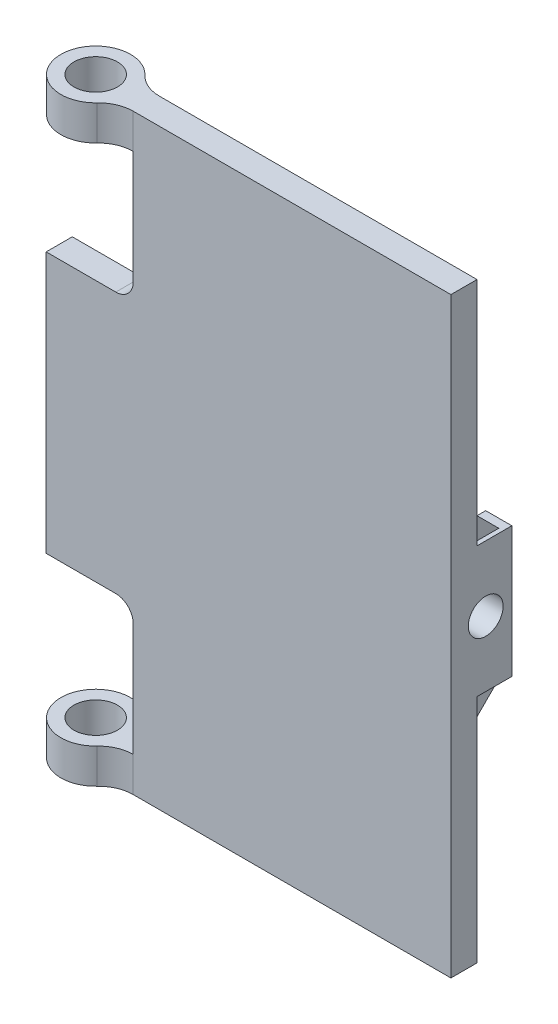
ISO-10303-21;
HEADER;
FILE_DESCRIPTION(('STEP AP214'),'2;1');
FILE_NAME('part.step','',(''),(''),'','','');
FILE_SCHEMA(('AUTOMOTIVE_DESIGN { 1 0 10303 214 1 1 1 1 }'));
ENDSEC;
DATA;
#1=APPLICATION_CONTEXT('core data for automotive mechanical design processes');
#2=APPLICATION_PROTOCOL_DEFINITION('international standard','automotive_design',2000,#1);
#3=PRODUCT_CONTEXT('',#1,'mechanical');
#4=PRODUCT('Part','Part','',(#3));
#5=PRODUCT_RELATED_PRODUCT_CATEGORY('part','',(#4));
#6=PRODUCT_DEFINITION_FORMATION('','',#4);
#7=PRODUCT_DEFINITION_CONTEXT('part definition',#1,'design');
#8=PRODUCT_DEFINITION('design','',#6,#7);
#9=PRODUCT_DEFINITION_SHAPE('','',#8);
#10=(LENGTH_UNIT() NAMED_UNIT(*) SI_UNIT(.MILLI.,.METRE.));
#11=(NAMED_UNIT(*) PLANE_ANGLE_UNIT() SI_UNIT($,.RADIAN.));
#12=(NAMED_UNIT(*) SI_UNIT($,.STERADIAN.) SOLID_ANGLE_UNIT());
#13=UNCERTAINTY_MEASURE_WITH_UNIT(LENGTH_MEASURE(1.E-05),#10,'distance_accuracy_value','');
#14=(GEOMETRIC_REPRESENTATION_CONTEXT(3) GLOBAL_UNCERTAINTY_ASSIGNED_CONTEXT((#13)) GLOBAL_UNIT_ASSIGNED_CONTEXT((#10,
#11,#12)) REPRESENTATION_CONTEXT('',''));
#15=CARTESIAN_POINT('',(0.,0.,0.));
#16=DIRECTION('',(0.,0.,1.));
#17=DIRECTION('',(1.,0.,0.));
#18=AXIS2_PLACEMENT_3D('',#15,#16,#17);
#19=CARTESIAN_POINT('',(-18.25,34.,3.));
#20=DIRECTION('',(1.,0.,0.));
#21=DIRECTION('',(0.,0.,-1.));
#22=AXIS2_PLACEMENT_3D('',#19,#20,#21);
#23=PLANE('',#22);
#24=DIRECTION('',(0.,-1.,0.));
#25=VECTOR('',#24,1.);
#26=CARTESIAN_POINT('',(-18.25,34.,3.));
#27=LINE('',#26,#25);
#28=CARTESIAN_POINT('',(-18.25,-17.,3.));
#29=VERTEX_POINT('',#28);
#30=CARTESIAN_POINT('',(-18.25,-30.,3.));
#31=VERTEX_POINT('',#30);
#32=EDGE_CURVE('E527',#29,#31,#27,.T.);
#33=ORIENTED_EDGE('',*,*,#32,.F.);
#34=DIRECTION('',(0.,0.,1.));
#35=VECTOR('',#34,1.);
#36=CARTESIAN_POINT('',(-18.25,-17.,3.));
#37=LINE('',#36,#35);
#38=CARTESIAN_POINT('',(-18.25,-17.,0.));
#39=VERTEX_POINT('',#38);
#40=EDGE_CURVE('E571',#29,#39,#37,.F.);
#41=ORIENTED_EDGE('',*,*,#40,.T.);
#42=DIRECTION('',(0.,-1.,0.));
#43=VECTOR('',#42,1.);
#44=CARTESIAN_POINT('',(-18.25,34.,0.));
#45=LINE('',#44,#43);
#46=CARTESIAN_POINT('',(-18.25,-30.,0.));
#47=VERTEX_POINT('',#46);
#48=EDGE_CURVE('E544',#39,#47,#45,.T.);
#49=ORIENTED_EDGE('',*,*,#48,.T.);
#50=DIRECTION('',(0.,0.,1.));
#51=VECTOR('',#50,1.);
#52=CARTESIAN_POINT('',(-18.25,-30.,3.));
#53=LINE('',#52,#51);
#54=EDGE_CURVE('E491',#47,#31,#53,.T.);
#55=ORIENTED_EDGE('',*,*,#54,.T.);
#56=EDGE_LOOP('',(#33,#41,#49,#55));
#57=FACE_BOUND('',#56,.T.);
#58=ADVANCED_FACE('F39',(#57),#23,.F.);
#59=CARTESIAN_POINT('',(0.,0.,0.));
#60=DIRECTION('',(0.,0.,1.));
#61=DIRECTION('',(1.,0.,0.));
#62=AXIS2_PLACEMENT_3D('',#59,#60,#61);
#63=PLANE('',#62);
#64=DIRECTION('',(-1.,0.,0.));
#65=VECTOR('',#64,1.);
#66=CARTESIAN_POINT('',(18.25,-7.5,0.));
#67=LINE('',#66,#65);
#68=CARTESIAN_POINT('',(15.75,-7.5,0.));
#69=VERTEX_POINT('',#68);
#70=CARTESIAN_POINT('',(15.25,-7.5,0.));
#71=VERTEX_POINT('',#70);
#72=EDGE_CURVE('E381',#69,#71,#67,.T.);
#73=ORIENTED_EDGE('',*,*,#72,.F.);
#74=DIRECTION('',(0.,-1.,0.));
#75=VECTOR('',#74,1.);
#76=CARTESIAN_POINT('',(15.75,-10.5,0.));
#77=LINE('',#76,#75);
#78=CARTESIAN_POINT('',(15.75,-10.5,0.));
#79=VERTEX_POINT('',#78);
#80=EDGE_CURVE('E296',#69,#79,#77,.T.);
#81=ORIENTED_EDGE('',*,*,#80,.T.);
#82=DIRECTION('',(1.,0.,0.));
#83=VECTOR('',#82,1.);
#84=CARTESIAN_POINT('',(15.75,-10.5,0.));
#85=LINE('',#84,#83);
#86=CARTESIAN_POINT('',(17.75,-10.5,0.));
#87=VERTEX_POINT('',#86);
#88=EDGE_CURVE('E299',#79,#87,#85,.T.);
#89=ORIENTED_EDGE('',*,*,#88,.T.);
#90=DIRECTION('',(0.,-1.,0.));
#91=VECTOR('',#90,1.);
#92=CARTESIAN_POINT('',(17.75,-10.5,0.));
#93=LINE('',#92,#91);
#94=CARTESIAN_POINT('',(17.75,-7.5,0.));
#95=VERTEX_POINT('',#94);
#96=EDGE_CURVE('E292',#95,#87,#93,.T.);
#97=ORIENTED_EDGE('',*,*,#96,.F.);
#98=CARTESIAN_POINT('',(18.25,-7.5,0.));
#99=VERTEX_POINT('',#98);
#100=EDGE_CURVE('E405',#99,#95,#67,.T.);
#101=ORIENTED_EDGE('',*,*,#100,.F.);
#102=DIRECTION('',(0.,1.,0.));
#103=VECTOR('',#102,1.);
#104=CARTESIAN_POINT('',(18.25,34.,0.));
#105=LINE('',#104,#103);
#106=CARTESIAN_POINT('',(18.25,-34.,0.));
#107=VERTEX_POINT('',#106);
#108=EDGE_CURVE('E537',#107,#99,#105,.T.);
#109=ORIENTED_EDGE('',*,*,#108,.F.);
#110=DIRECTION('',(1.,0.,0.));
#111=VECTOR('',#110,1.);
#112=CARTESIAN_POINT('',(-18.25,-34.,0.));
#113=LINE('',#112,#111);
#114=CARTESIAN_POINT('',(-18.25,-34.,0.));
#115=VERTEX_POINT('',#114);
#116=EDGE_CURVE('E524',#115,#107,#113,.T.);
#117=ORIENTED_EDGE('',*,*,#116,.F.);
#118=DIRECTION('',(0.,-1.,0.));
#119=VECTOR('',#118,1.);
#120=CARTESIAN_POINT('',(-18.25,-30.,0.));
#121=LINE('',#120,#119);
#122=EDGE_CURVE('E511',#47,#115,#121,.T.);
#123=ORIENTED_EDGE('',*,*,#122,.F.);
#124=ORIENTED_EDGE('',*,*,#48,.F.);
#125=CARTESIAN_POINT('',(-20.25,-17.,0.));
#126=DIRECTION('',(0.,0.,1.));
#127=DIRECTION('',(1.,0.,0.));
#128=AXIS2_PLACEMENT_3D('',#125,#126,#127);
#129=CIRCLE('',#128,2.);
#130=CARTESIAN_POINT('',(-20.25,-15.,0.));
#131=VERTEX_POINT('',#130);
#132=EDGE_CURVE('E583',#39,#131,#129,.T.);
#133=ORIENTED_EDGE('',*,*,#132,.T.);
#134=DIRECTION('',(1.,0.,0.));
#135=VECTOR('',#134,1.);
#136=CARTESIAN_POINT('',(-28.25,-15.,0.));
#137=LINE('',#136,#135);
#138=CARTESIAN_POINT('',(-28.25,-15.,0.));
#139=VERTEX_POINT('',#138);
#140=EDGE_CURVE('E267',#139,#131,#137,.T.);
#141=ORIENTED_EDGE('',*,*,#140,.F.);
#142=DIRECTION('',(0.,-1.,0.));
#143=VECTOR('',#142,1.);
#144=CARTESIAN_POINT('',(-28.25,15.,0.));
#145=LINE('',#144,#143);
#146=CARTESIAN_POINT('',(-28.25,15.,0.));
#147=VERTEX_POINT('',#146);
#148=EDGE_CURVE('E256',#147,#139,#145,.T.);
#149=ORIENTED_EDGE('',*,*,#148,.F.);
#150=DIRECTION('',(-1.,0.,0.));
#151=VECTOR('',#150,1.);
#152=CARTESIAN_POINT('',(-18.25,15.,0.));
#153=LINE('',#152,#151);
#154=CARTESIAN_POINT('',(-20.25,15.,0.));
#155=VERTEX_POINT('',#154);
#156=EDGE_CURVE('E244',#155,#147,#153,.T.);
#157=ORIENTED_EDGE('',*,*,#156,.F.);
#158=CARTESIAN_POINT('',(-20.25,17.,0.));
#159=DIRECTION('',(0.,0.,1.));
#160=DIRECTION('',(1.,0.,0.));
#161=AXIS2_PLACEMENT_3D('',#158,#159,#160);
#162=CIRCLE('',#161,2.);
#163=CARTESIAN_POINT('',(-18.25,17.,0.));
#164=VERTEX_POINT('',#163);
#165=EDGE_CURVE('E577',#155,#164,#162,.T.);
#166=ORIENTED_EDGE('',*,*,#165,.T.);
#167=CARTESIAN_POINT('',(-18.25,30.,0.));
#168=VERTEX_POINT('',#167);
#169=EDGE_CURVE('E549',#168,#164,#45,.T.);
#170=ORIENTED_EDGE('',*,*,#169,.F.);
#171=CARTESIAN_POINT('',(-18.25,34.,0.));
#172=VERTEX_POINT('',#171);
#173=EDGE_CURVE('E545',#172,#168,#45,.T.);
#174=ORIENTED_EDGE('',*,*,#173,.F.);
#175=DIRECTION('',(-1.,0.,0.));
#176=VECTOR('',#175,1.);
#177=CARTESIAN_POINT('',(-18.25,34.,0.));
#178=LINE('',#177,#176);
#179=CARTESIAN_POINT('',(18.25,34.,0.));
#180=VERTEX_POINT('',#179);
#181=EDGE_CURVE('E541',#180,#172,#178,.T.);
#182=ORIENTED_EDGE('',*,*,#181,.F.);
#183=CARTESIAN_POINT('',(18.25,7.5,0.));
#184=VERTEX_POINT('',#183);
#185=EDGE_CURVE('E510',#184,#180,#105,.T.);
#186=ORIENTED_EDGE('',*,*,#185,.F.);
#187=DIRECTION('',(1.,0.,0.));
#188=VECTOR('',#187,1.);
#189=CARTESIAN_POINT('',(18.25,7.5,0.));
#190=LINE('',#189,#188);
#191=CARTESIAN_POINT('',(17.75,7.5,0.));
#192=VERTEX_POINT('',#191);
#193=EDGE_CURVE('E408',#192,#184,#190,.T.);
#194=ORIENTED_EDGE('',*,*,#193,.F.);
#195=DIRECTION('',(0.,1.,0.));
#196=VECTOR('',#195,1.);
#197=CARTESIAN_POINT('',(17.75,10.5,0.));
#198=LINE('',#197,#196);
#199=CARTESIAN_POINT('',(17.75,10.5,0.));
#200=VERTEX_POINT('',#199);
#201=EDGE_CURVE('E333',#192,#200,#198,.T.);
#202=ORIENTED_EDGE('',*,*,#201,.T.);
#203=DIRECTION('',(1.,0.,0.));
#204=VECTOR('',#203,1.);
#205=CARTESIAN_POINT('',(15.75,10.5,0.));
#206=LINE('',#205,#204);
#207=CARTESIAN_POINT('',(15.75,10.5,0.));
#208=VERTEX_POINT('',#207);
#209=EDGE_CURVE('E341',#208,#200,#206,.T.);
#210=ORIENTED_EDGE('',*,*,#209,.F.);
#211=DIRECTION('',(0.,1.,0.));
#212=VECTOR('',#211,1.);
#213=CARTESIAN_POINT('',(15.75,10.5,0.));
#214=LINE('',#213,#212);
#215=CARTESIAN_POINT('',(15.75,7.5,0.));
#216=VERTEX_POINT('',#215);
#217=EDGE_CURVE('E321',#216,#208,#214,.T.);
#218=ORIENTED_EDGE('',*,*,#217,.F.);
#219=CARTESIAN_POINT('',(15.25,7.5,0.));
#220=VERTEX_POINT('',#219);
#221=EDGE_CURVE('E395',#220,#216,#190,.T.);
#222=ORIENTED_EDGE('',*,*,#221,.F.);
#223=DIRECTION('',(0.,-1.,0.));
#224=VECTOR('',#223,1.);
#225=CARTESIAN_POINT('',(15.25,7.5,0.));
#226=LINE('',#225,#224);
#227=CARTESIAN_POINT('',(15.25,15.,0.));
#228=VERTEX_POINT('',#227);
#229=EDGE_CURVE('E354',#228,#220,#226,.T.);
#230=ORIENTED_EDGE('',*,*,#229,.F.);
#231=DIRECTION('',(1.,0.,0.));
#232=VECTOR('',#231,1.);
#233=CARTESIAN_POINT('',(15.25,15.,0.));
#234=LINE('',#233,#232);
#235=CARTESIAN_POINT('',(3.25,15.,0.));
#236=VERTEX_POINT('',#235);
#237=EDGE_CURVE('E371',#236,#228,#234,.T.);
#238=ORIENTED_EDGE('',*,*,#237,.F.);
#239=DIRECTION('',(0.,1.,0.));
#240=VECTOR('',#239,1.);
#241=CARTESIAN_POINT('',(3.25,15.,0.));
#242=LINE('',#241,#240);
#243=CARTESIAN_POINT('',(3.25,-15.,0.));
#244=VERTEX_POINT('',#243);
#245=EDGE_CURVE('E367',#244,#236,#242,.T.);
#246=ORIENTED_EDGE('',*,*,#245,.F.);
#247=DIRECTION('',(-1.,0.,0.));
#248=VECTOR('',#247,1.);
#249=CARTESIAN_POINT('',(15.25,-15.,0.));
#250=LINE('',#249,#248);
#251=CARTESIAN_POINT('',(15.25,-15.,0.));
#252=VERTEX_POINT('',#251);
#253=EDGE_CURVE('E363',#252,#244,#250,.T.);
#254=ORIENTED_EDGE('',*,*,#253,.F.);
#255=EDGE_CURVE('E375',#71,#252,#226,.T.);
#256=ORIENTED_EDGE('',*,*,#255,.F.);
#257=EDGE_LOOP('',(#73,#81,#89,#97,#101,#109,#117,#123,#124,#133,#141,#149,#157,#166,#170,#174,
#182,#186,#194,#202,#210,#218,#222,#230,#238,#246,#254,#256));
#258=FACE_BOUND('',#257,.T.);
#259=ADVANCED_FACE('F270',(#258),#63,.F.);
#260=ORIENTED_EDGE('',*,*,#169,.T.);
#261=DIRECTION('',(0.,0.,1.));
#262=VECTOR('',#261,1.);
#263=CARTESIAN_POINT('',(-18.25,17.,3.));
#264=LINE('',#263,#262);
#265=CARTESIAN_POINT('',(-18.25,17.,3.));
#266=VERTEX_POINT('',#265);
#267=EDGE_CURVE('E559',#164,#266,#264,.T.);
#268=ORIENTED_EDGE('',*,*,#267,.T.);
#269=CARTESIAN_POINT('',(-18.25,30.,3.));
#270=VERTEX_POINT('',#269);
#271=EDGE_CURVE('E533',#270,#266,#27,.T.);
#272=ORIENTED_EDGE('',*,*,#271,.F.);
#273=DIRECTION('',(0.,0.,-1.));
#274=VECTOR('',#273,1.);
#275=CARTESIAN_POINT('',(-18.25,30.,3.));
#276=LINE('',#275,#274);
#277=EDGE_CURVE('E440',#270,#168,#276,.T.);
#278=ORIENTED_EDGE('',*,*,#277,.T.);
#279=EDGE_LOOP('',(#260,#268,#272,#278));
#280=FACE_BOUND('',#279,.T.);
#281=ADVANCED_FACE('F691',(#280),#23,.F.);
#282=CARTESIAN_POINT('',(18.25,34.,3.));
#283=DIRECTION('',(-1.,0.,0.));
#284=DIRECTION('',(0.,0.,1.));
#285=AXIS2_PLACEMENT_3D('',#282,#283,#284);
#286=PLANE('',#285);
#287=CARTESIAN_POINT('',(18.25,0.,-1.));
#288=DIRECTION('',(1.,0.,0.));
#289=DIRECTION('',(0.,0.,-1.));
#290=AXIS2_PLACEMENT_3D('',#287,#288,#289);
#291=CIRCLE('',#290,2.);
#292=CARTESIAN_POINT('',(18.25,0.,-3.));
#293=VERTEX_POINT('',#292);
#294=EDGE_CURVE('E345',#293,#293,#291,.T.);
#295=ORIENTED_EDGE('',*,*,#294,.F.);
#296=EDGE_LOOP('',(#295));
#297=FACE_BOUND('',#296,.T.);
#298=ORIENTED_EDGE('',*,*,#108,.T.);
#299=DIRECTION('',(0.,0.,1.));
#300=VECTOR('',#299,1.);
#301=CARTESIAN_POINT('',(18.25,-7.5,-4.));
#302=LINE('',#301,#300);
#303=CARTESIAN_POINT('',(18.25,-7.5,-4.));
#304=VERTEX_POINT('',#303);
#305=EDGE_CURVE('E423',#304,#99,#302,.T.);
#306=ORIENTED_EDGE('',*,*,#305,.F.);
#307=DIRECTION('',(0.,-1.,0.));
#308=VECTOR('',#307,1.);
#309=CARTESIAN_POINT('',(18.25,7.5,-4.));
#310=LINE('',#309,#308);
#311=CARTESIAN_POINT('',(18.25,7.5,-4.));
#312=VERTEX_POINT('',#311);
#313=EDGE_CURVE('E390',#312,#304,#310,.T.);
#314=ORIENTED_EDGE('',*,*,#313,.F.);
#315=DIRECTION('',(0.,0.,1.));
#316=VECTOR('',#315,1.);
#317=CARTESIAN_POINT('',(18.25,7.5,-4.));
#318=LINE('',#317,#316);
#319=EDGE_CURVE('E404',#312,#184,#318,.T.);
#320=ORIENTED_EDGE('',*,*,#319,.T.);
#321=ORIENTED_EDGE('',*,*,#185,.T.);
#322=DIRECTION('',(0.,0.,-1.));
#323=VECTOR('',#322,1.);
#324=CARTESIAN_POINT('',(18.25,34.,3.));
#325=LINE('',#324,#323);
#326=CARTESIAN_POINT('',(18.25,34.,3.));
#327=VERTEX_POINT('',#326);
#328=EDGE_CURVE('E555',#327,#180,#325,.T.);
#329=ORIENTED_EDGE('',*,*,#328,.F.);
#330=DIRECTION('',(0.,1.,0.));
#331=VECTOR('',#330,1.);
#332=CARTESIAN_POINT('',(18.25,34.,3.));
#333=LINE('',#332,#331);
#334=CARTESIAN_POINT('',(18.25,-34.,3.));
#335=VERTEX_POINT('',#334);
#336=EDGE_CURVE('E519',#335,#327,#333,.T.);
#337=ORIENTED_EDGE('',*,*,#336,.F.);
#338=DIRECTION('',(0.,0.,-1.));
#339=VECTOR('',#338,1.);
#340=CARTESIAN_POINT('',(18.25,-34.,3.));
#341=LINE('',#340,#339);
#342=EDGE_CURVE('E536',#335,#107,#341,.T.);
#343=ORIENTED_EDGE('',*,*,#342,.T.);
#344=EDGE_LOOP('',(#298,#306,#314,#320,#321,#329,#337,#343));
#345=FACE_BOUND('',#344,.T.);
#346=ADVANCED_FACE('F653',(#297,#345),#286,.F.);
#347=CARTESIAN_POINT('',(-18.25,34.,3.));
#348=DIRECTION('',(0.,-1.,0.));
#349=DIRECTION('',(0.,0.,-1.));
#350=AXIS2_PLACEMENT_3D('',#347,#348,#349);
#351=PLANE('',#350);
#352=CARTESIAN_POINT('',(-24.0594750193111,34.,1.5));
#353=DIRECTION('',(0.,1.,0.));
#354=DIRECTION('',(0.,0.,1.));
#355=AXIS2_PLACEMENT_3D('',#352,#353,#354);
#356=CIRCLE('',#355,2.5);
#357=CARTESIAN_POINT('',(-24.0594750193111,34.,4.));
#358=VERTEX_POINT('',#357);
#359=EDGE_CURVE('E427',#358,#358,#356,.T.);
#360=ORIENTED_EDGE('',*,*,#359,.F.);
#361=EDGE_LOOP('',(#360));
#362=FACE_BOUND('',#361,.T.);
#363=ORIENTED_EDGE('',*,*,#181,.T.);
#364=CARTESIAN_POINT('',(-18.25,34.,-4.));
#365=DIRECTION('',(0.,-1.,0.));
#366=DIRECTION('',(0.,0.,1.));
#367=AXIS2_PLACEMENT_3D('',#364,#365,#366);
#368=CIRCLE('',#367,4.);
#369=CARTESIAN_POINT('',(-21.1547375096556,34.,-1.25));
#370=VERTEX_POINT('',#369);
#371=EDGE_CURVE('E457',#172,#370,#368,.T.);
#372=ORIENTED_EDGE('',*,*,#371,.T.);
#373=CARTESIAN_POINT('',(-24.0594750193111,34.,1.5));
#374=DIRECTION('',(0.,1.,0.));
#375=DIRECTION('',(0.,0.,1.));
#376=AXIS2_PLACEMENT_3D('',#373,#374,#375);
#377=CIRCLE('',#376,4.);
#378=CARTESIAN_POINT('',(-21.1547375096556,34.,4.25));
#379=VERTEX_POINT('',#378);
#380=EDGE_CURVE('E441',#370,#379,#377,.T.);
#381=ORIENTED_EDGE('',*,*,#380,.T.);
#382=CARTESIAN_POINT('',(-18.25,34.,7.));
#383=DIRECTION('',(0.,-1.,0.));
#384=DIRECTION('',(0.,0.,1.));
#385=AXIS2_PLACEMENT_3D('',#382,#383,#384);
#386=CIRCLE('',#385,4.);
#387=CARTESIAN_POINT('',(-18.25,34.,3.));
#388=VERTEX_POINT('',#387);
#389=EDGE_CURVE('E432',#379,#388,#386,.T.);
#390=ORIENTED_EDGE('',*,*,#389,.T.);
#391=DIRECTION('',(-1.,0.,0.));
#392=VECTOR('',#391,1.);
#393=CARTESIAN_POINT('',(-18.25,34.,3.));
#394=LINE('',#393,#392);
#395=EDGE_CURVE('E523',#327,#388,#394,.T.);
#396=ORIENTED_EDGE('',*,*,#395,.F.);
#397=ORIENTED_EDGE('',*,*,#328,.T.);
#398=EDGE_LOOP('',(#363,#372,#381,#390,#396,#397));
#399=FACE_BOUND('',#398,.T.);
#400=ADVANCED_FACE('F707',(#362,#399),#351,.F.);
#401=CARTESIAN_POINT('',(-18.25,-34.,3.));
#402=DIRECTION('',(0.,1.,0.));
#403=DIRECTION('',(0.,0.,1.));
#404=AXIS2_PLACEMENT_3D('',#401,#402,#403);
#405=PLANE('',#404);
#406=ORIENTED_EDGE('',*,*,#116,.T.);
#407=ORIENTED_EDGE('',*,*,#342,.F.);
#408=DIRECTION('',(1.,0.,0.));
#409=VECTOR('',#408,1.);
#410=CARTESIAN_POINT('',(-18.25,-34.,3.));
#411=LINE('',#410,#409);
#412=CARTESIAN_POINT('',(-18.25,-34.,3.));
#413=VERTEX_POINT('',#412);
#414=EDGE_CURVE('E532',#413,#335,#411,.T.);
#415=ORIENTED_EDGE('',*,*,#414,.F.);
#416=CARTESIAN_POINT('',(-18.25,-34.,7.));
#417=DIRECTION('',(0.,1.,0.));
#418=DIRECTION('',(0.,0.,-1.));
#419=AXIS2_PLACEMENT_3D('',#416,#417,#418);
#420=CIRCLE('',#419,4.);
#421=CARTESIAN_POINT('',(-21.1547375096556,-34.,4.25));
#422=VERTEX_POINT('',#421);
#423=EDGE_CURVE('E474',#413,#422,#420,.T.);
#424=ORIENTED_EDGE('',*,*,#423,.T.);
#425=CARTESIAN_POINT('',(-24.0594750193111,-34.,1.5));
#426=DIRECTION('',(0.,-1.,0.));
#427=DIRECTION('',(0.,0.,-1.));
#428=AXIS2_PLACEMENT_3D('',#425,#426,#427);
#429=CIRCLE('',#428,4.);
#430=CARTESIAN_POINT('',(-21.1547375096556,-34.,-1.25));
#431=VERTEX_POINT('',#430);
#432=EDGE_CURVE('E499',#422,#431,#429,.T.);
#433=ORIENTED_EDGE('',*,*,#432,.T.);
#434=CARTESIAN_POINT('',(-18.25,-34.,-4.));
#435=DIRECTION('',(0.,1.,0.));
#436=DIRECTION('',(0.,0.,1.));
#437=AXIS2_PLACEMENT_3D('',#434,#435,#436);
#438=CIRCLE('',#437,4.);
#439=EDGE_CURVE('E483',#431,#115,#438,.T.);
#440=ORIENTED_EDGE('',*,*,#439,.T.);
#441=EDGE_LOOP('',(#406,#407,#415,#424,#433,#440));
#442=FACE_BOUND('',#441,.T.);
#443=CARTESIAN_POINT('',(-24.0594750193111,-34.,1.5));
#444=DIRECTION('',(0.,-1.,0.));
#445=DIRECTION('',(0.,0.,-1.));
#446=AXIS2_PLACEMENT_3D('',#443,#444,#445);
#447=CIRCLE('',#446,2.5);
#448=CARTESIAN_POINT('',(-24.0594750193111,-34.,-0.999999999999999));
#449=VERTEX_POINT('',#448);
#450=EDGE_CURVE('E467',#449,#449,#447,.T.);
#451=ORIENTED_EDGE('',*,*,#450,.F.);
#452=EDGE_LOOP('',(#451));
#453=FACE_BOUND('',#452,.T.);
#454=ADVANCED_FACE('F660',(#442,#453),#405,.F.);
#455=CARTESIAN_POINT('',(0.,0.,3.));
#456=DIRECTION('',(0.,0.,1.));
#457=DIRECTION('',(1.,0.,0.));
#458=AXIS2_PLACEMENT_3D('',#455,#456,#457);
#459=PLANE('',#458);
#460=ORIENTED_EDGE('',*,*,#336,.T.);
#461=ORIENTED_EDGE('',*,*,#395,.T.);
#462=EDGE_CURVE('E528',#388,#270,#27,.T.);
#463=ORIENTED_EDGE('',*,*,#462,.T.);
#464=ORIENTED_EDGE('',*,*,#271,.T.);
#465=CARTESIAN_POINT('',(-20.25,17.,3.));
#466=DIRECTION('',(0.,0.,1.));
#467=DIRECTION('',(1.,0.,0.));
#468=AXIS2_PLACEMENT_3D('',#465,#466,#467);
#469=CIRCLE('',#468,2.);
#470=CARTESIAN_POINT('',(-20.25,15.,3.));
#471=VERTEX_POINT('',#470);
#472=EDGE_CURVE('E574',#266,#471,#469,.F.);
#473=ORIENTED_EDGE('',*,*,#472,.T.);
#474=DIRECTION('',(-1.,0.,0.));
#475=VECTOR('',#474,1.);
#476=CARTESIAN_POINT('',(-18.25,15.,3.));
#477=LINE('',#476,#475);
#478=CARTESIAN_POINT('',(-28.25,15.,3.));
#479=VERTEX_POINT('',#478);
#480=EDGE_CURVE('E277',#471,#479,#477,.T.);
#481=ORIENTED_EDGE('',*,*,#480,.T.);
#482=DIRECTION('',(0.,-1.,0.));
#483=VECTOR('',#482,1.);
#484=CARTESIAN_POINT('',(-28.25,15.,3.));
#485=LINE('',#484,#483);
#486=CARTESIAN_POINT('',(-28.25,-15.,3.));
#487=VERTEX_POINT('',#486);
#488=EDGE_CURVE('E264',#479,#487,#485,.T.);
#489=ORIENTED_EDGE('',*,*,#488,.T.);
#490=DIRECTION('',(1.,0.,0.));
#491=VECTOR('',#490,1.);
#492=CARTESIAN_POINT('',(-28.25,-15.,3.));
#493=LINE('',#492,#491);
#494=CARTESIAN_POINT('',(-20.25,-15.,3.));
#495=VERTEX_POINT('',#494);
#496=EDGE_CURVE('E257',#487,#495,#493,.T.);
#497=ORIENTED_EDGE('',*,*,#496,.T.);
#498=CARTESIAN_POINT('',(-20.25,-17.,3.));
#499=DIRECTION('',(0.,0.,1.));
#500=DIRECTION('',(1.,0.,0.));
#501=AXIS2_PLACEMENT_3D('',#498,#499,#500);
#502=CIRCLE('',#501,2.);
#503=EDGE_CURVE('E580',#495,#29,#502,.F.);
#504=ORIENTED_EDGE('',*,*,#503,.T.);
#505=ORIENTED_EDGE('',*,*,#32,.T.);
#506=DIRECTION('',(0.,-1.,0.));
#507=VECTOR('',#506,1.);
#508=CARTESIAN_POINT('',(-18.25,-30.,3.));
#509=LINE('',#508,#507);
#510=EDGE_CURVE('E506',#31,#413,#509,.T.);
#511=ORIENTED_EDGE('',*,*,#510,.T.);
#512=ORIENTED_EDGE('',*,*,#414,.T.);
#513=EDGE_LOOP('',(#460,#461,#463,#464,#473,#481,#489,#497,#504,#505,#511,#512));
#514=FACE_BOUND('',#513,.T.);
#515=ADVANCED_FACE('F685',(#514),#459,.T.);
#516=CARTESIAN_POINT('',(-18.25,-30.,7.));
#517=DIRECTION('',(0.,-1.,0.));
#518=DIRECTION('',(0.,0.,-1.));
#519=AXIS2_PLACEMENT_3D('',#516,#517,#518);
#520=CYLINDRICAL_SURFACE('',#519,4.);
#521=ORIENTED_EDGE('',*,*,#423,.F.);
#522=ORIENTED_EDGE('',*,*,#510,.F.);
#523=CARTESIAN_POINT('',(-18.25,-30.,7.));
#524=DIRECTION('',(0.,1.,0.));
#525=DIRECTION('',(0.,0.,-1.));
#526=AXIS2_PLACEMENT_3D('',#523,#524,#525);
#527=CIRCLE('',#526,4.);
#528=CARTESIAN_POINT('',(-21.1547375096556,-30.,4.25));
#529=VERTEX_POINT('',#528);
#530=EDGE_CURVE('E478',#31,#529,#527,.T.);
#531=ORIENTED_EDGE('',*,*,#530,.T.);
#532=DIRECTION('',(0.,-1.,0.));
#533=VECTOR('',#532,1.);
#534=CARTESIAN_POINT('',(-21.1547375096556,-30.,4.25));
#535=LINE('',#534,#533);
#536=EDGE_CURVE('E495',#529,#422,#535,.T.);
#537=ORIENTED_EDGE('',*,*,#536,.T.);
#538=EDGE_LOOP('',(#521,#522,#531,#537));
#539=FACE_BOUND('',#538,.T.);
#540=ADVANCED_FACE('F714',(#539),#520,.F.);
#541=CARTESIAN_POINT('',(-18.25,-30.,-4.));
#542=DIRECTION('',(0.,-1.,0.));
#543=DIRECTION('',(0.,0.,-1.));
#544=AXIS2_PLACEMENT_3D('',#541,#542,#543);
#545=CYLINDRICAL_SURFACE('',#544,4.);
#546=ORIENTED_EDGE('',*,*,#439,.F.);
#547=DIRECTION('',(0.,-1.,0.));
#548=VECTOR('',#547,1.);
#549=CARTESIAN_POINT('',(-21.1547375096556,-30.,-1.25));
#550=LINE('',#549,#548);
#551=CARTESIAN_POINT('',(-21.1547375096556,-30.,-1.25));
#552=VERTEX_POINT('',#551);
#553=EDGE_CURVE('E514',#552,#431,#550,.T.);
#554=ORIENTED_EDGE('',*,*,#553,.F.);
#555=CARTESIAN_POINT('',(-18.25,-30.,-4.));
#556=DIRECTION('',(0.,1.,0.));
#557=DIRECTION('',(0.,0.,1.));
#558=AXIS2_PLACEMENT_3D('',#555,#556,#557);
#559=CIRCLE('',#558,4.);
#560=EDGE_CURVE('E487',#552,#47,#559,.T.);
#561=ORIENTED_EDGE('',*,*,#560,.T.);
#562=ORIENTED_EDGE('',*,*,#122,.T.);
#563=EDGE_LOOP('',(#546,#554,#561,#562));
#564=FACE_BOUND('',#563,.T.);
#565=ADVANCED_FACE('F666',(#564),#545,.F.);
#566=CARTESIAN_POINT('',(-24.0594750193111,-30.,1.5));
#567=DIRECTION('',(0.,-1.,0.));
#568=DIRECTION('',(0.,0.,-1.));
#569=AXIS2_PLACEMENT_3D('',#566,#567,#568);
#570=CYLINDRICAL_SURFACE('',#569,4.);
#571=ORIENTED_EDGE('',*,*,#432,.F.);
#572=ORIENTED_EDGE('',*,*,#536,.F.);
#573=CARTESIAN_POINT('',(-24.0594750193111,-30.,1.5));
#574=DIRECTION('',(0.,-1.,0.));
#575=DIRECTION('',(0.,0.,-1.));
#576=AXIS2_PLACEMENT_3D('',#573,#574,#575);
#577=CIRCLE('',#576,4.);
#578=EDGE_CURVE('E482',#529,#552,#577,.T.);
#579=ORIENTED_EDGE('',*,*,#578,.T.);
#580=ORIENTED_EDGE('',*,*,#553,.T.);
#581=EDGE_LOOP('',(#571,#572,#579,#580));
#582=FACE_BOUND('',#581,.T.);
#583=ADVANCED_FACE('F716',(#582),#570,.T.);
#584=CARTESIAN_POINT('',(-18.25,-30.,7.));
#585=DIRECTION('',(0.,-1.,0.));
#586=DIRECTION('',(0.,0.,-1.));
#587=AXIS2_PLACEMENT_3D('',#584,#585,#586);
#588=PLANE('',#587);
#589=CARTESIAN_POINT('',(-24.0594750193111,-30.,1.5));
#590=DIRECTION('',(0.,-1.,0.));
#591=DIRECTION('',(0.,0.,-1.));
#592=AXIS2_PLACEMENT_3D('',#589,#590,#591);
#593=CIRCLE('',#592,2.5);
#594=CARTESIAN_POINT('',(-24.0594750193111,-30.,-0.999999999999999));
#595=VERTEX_POINT('',#594);
#596=EDGE_CURVE('E470',#595,#595,#593,.T.);
#597=ORIENTED_EDGE('',*,*,#596,.T.);
#598=EDGE_LOOP('',(#597));
#599=FACE_BOUND('',#598,.T.);
#600=ORIENTED_EDGE('',*,*,#530,.F.);
#601=ORIENTED_EDGE('',*,*,#54,.F.);
#602=ORIENTED_EDGE('',*,*,#560,.F.);
#603=ORIENTED_EDGE('',*,*,#578,.F.);
#604=EDGE_LOOP('',(#600,#601,#602,#603));
#605=FACE_BOUND('',#604,.T.);
#606=ADVANCED_FACE('F672',(#599,#605),#588,.F.);
#607=CARTESIAN_POINT('',(-24.0594750193111,-30.,1.5));
#608=DIRECTION('',(0.,-1.,0.));
#609=DIRECTION('',(0.,0.,-1.));
#610=AXIS2_PLACEMENT_3D('',#607,#608,#609);
#611=CYLINDRICAL_SURFACE('',#610,2.5);
#612=ORIENTED_EDGE('',*,*,#596,.F.);
#613=EDGE_LOOP('',(#612));
#614=FACE_BOUND('',#613,.T.);
#615=ORIENTED_EDGE('',*,*,#450,.T.);
#616=EDGE_LOOP('',(#615));
#617=FACE_BOUND('',#616,.T.);
#618=ADVANCED_FACE('F723',(#614,#617),#611,.F.);
#619=CARTESIAN_POINT('',(-18.25,30.,7.));
#620=DIRECTION('',(0.,1.,0.));
#621=DIRECTION('',(0.,0.,1.));
#622=AXIS2_PLACEMENT_3D('',#619,#620,#621);
#623=CYLINDRICAL_SURFACE('',#622,4.);
#624=ORIENTED_EDGE('',*,*,#389,.F.);
#625=DIRECTION('',(0.,1.,0.));
#626=VECTOR('',#625,1.);
#627=CARTESIAN_POINT('',(-21.1547375096556,30.,4.25));
#628=LINE('',#627,#626);
#629=CARTESIAN_POINT('',(-21.1547375096556,30.,4.25));
#630=VERTEX_POINT('',#629);
#631=EDGE_CURVE('E464',#630,#379,#628,.T.);
#632=ORIENTED_EDGE('',*,*,#631,.F.);
#633=CARTESIAN_POINT('',(-18.25,30.,7.));
#634=DIRECTION('',(0.,-1.,0.));
#635=DIRECTION('',(0.,0.,1.));
#636=AXIS2_PLACEMENT_3D('',#633,#634,#635);
#637=CIRCLE('',#636,4.);
#638=EDGE_CURVE('E436',#630,#270,#637,.T.);
#639=ORIENTED_EDGE('',*,*,#638,.T.);
#640=ORIENTED_EDGE('',*,*,#462,.F.);
#641=EDGE_LOOP('',(#624,#632,#639,#640));
#642=FACE_BOUND('',#641,.T.);
#643=ADVANCED_FACE('F960',(#642),#623,.F.);
#644=CARTESIAN_POINT('',(-24.0594750193111,30.,1.5));
#645=DIRECTION('',(0.,1.,0.));
#646=DIRECTION('',(0.,0.,1.));
#647=AXIS2_PLACEMENT_3D('',#644,#645,#646);
#648=CYLINDRICAL_SURFACE('',#647,4.);
#649=ORIENTED_EDGE('',*,*,#380,.F.);
#650=DIRECTION('',(0.,1.,0.));
#651=VECTOR('',#650,1.);
#652=CARTESIAN_POINT('',(-21.1547375096556,30.,-1.25));
#653=LINE('',#652,#651);
#654=CARTESIAN_POINT('',(-21.1547375096556,30.,-1.25));
#655=VERTEX_POINT('',#654);
#656=EDGE_CURVE('E453',#655,#370,#653,.T.);
#657=ORIENTED_EDGE('',*,*,#656,.F.);
#658=CARTESIAN_POINT('',(-24.0594750193111,30.,1.5));
#659=DIRECTION('',(0.,1.,0.));
#660=DIRECTION('',(0.,0.,1.));
#661=AXIS2_PLACEMENT_3D('',#658,#659,#660);
#662=CIRCLE('',#661,4.);
#663=EDGE_CURVE('E449',#655,#630,#662,.T.);
#664=ORIENTED_EDGE('',*,*,#663,.T.);
#665=ORIENTED_EDGE('',*,*,#631,.T.);
#666=EDGE_LOOP('',(#649,#657,#664,#665));
#667=FACE_BOUND('',#666,.T.);
#668=ADVANCED_FACE('F704',(#667),#648,.T.);
#669=CARTESIAN_POINT('',(-18.25,30.,-4.));
#670=DIRECTION('',(0.,1.,0.));
#671=DIRECTION('',(0.,0.,1.));
#672=AXIS2_PLACEMENT_3D('',#669,#670,#671);
#673=CYLINDRICAL_SURFACE('',#672,4.);
#674=ORIENTED_EDGE('',*,*,#371,.F.);
#675=ORIENTED_EDGE('',*,*,#173,.T.);
#676=CARTESIAN_POINT('',(-18.25,30.,-4.));
#677=DIRECTION('',(0.,-1.,0.));
#678=DIRECTION('',(0.,0.,1.));
#679=AXIS2_PLACEMENT_3D('',#676,#677,#678);
#680=CIRCLE('',#679,4.);
#681=EDGE_CURVE('E445',#168,#655,#680,.T.);
#682=ORIENTED_EDGE('',*,*,#681,.T.);
#683=ORIENTED_EDGE('',*,*,#656,.T.);
#684=EDGE_LOOP('',(#674,#675,#682,#683));
#685=FACE_BOUND('',#684,.T.);
#686=ADVANCED_FACE('F698',(#685),#673,.F.);
#687=CARTESIAN_POINT('',(-18.25,30.,7.));
#688=DIRECTION('',(0.,1.,0.));
#689=DIRECTION('',(0.,0.,1.));
#690=AXIS2_PLACEMENT_3D('',#687,#688,#689);
#691=PLANE('',#690);
#692=CARTESIAN_POINT('',(-24.0594750193111,30.,1.5));
#693=DIRECTION('',(0.,1.,0.));
#694=DIRECTION('',(0.,0.,1.));
#695=AXIS2_PLACEMENT_3D('',#692,#693,#694);
#696=CIRCLE('',#695,2.5);
#697=CARTESIAN_POINT('',(-24.0594750193111,30.,4.));
#698=VERTEX_POINT('',#697);
#699=EDGE_CURVE('E428',#698,#698,#696,.T.);
#700=ORIENTED_EDGE('',*,*,#699,.T.);
#701=EDGE_LOOP('',(#700));
#702=FACE_BOUND('',#701,.T.);
#703=ORIENTED_EDGE('',*,*,#638,.F.);
#704=ORIENTED_EDGE('',*,*,#663,.F.);
#705=ORIENTED_EDGE('',*,*,#681,.F.);
#706=ORIENTED_EDGE('',*,*,#277,.F.);
#707=EDGE_LOOP('',(#703,#704,#705,#706));
#708=FACE_BOUND('',#707,.T.);
#709=ADVANCED_FACE('F701',(#702,#708),#691,.F.);
#710=CARTESIAN_POINT('',(-24.0594750193111,30.,1.5));
#711=DIRECTION('',(0.,1.,0.));
#712=DIRECTION('',(0.,0.,1.));
#713=AXIS2_PLACEMENT_3D('',#710,#711,#712);
#714=CYLINDRICAL_SURFACE('',#713,2.5);
#715=ORIENTED_EDGE('',*,*,#699,.F.);
#716=EDGE_LOOP('',(#715));
#717=FACE_BOUND('',#716,.T.);
#718=ORIENTED_EDGE('',*,*,#359,.T.);
#719=EDGE_LOOP('',(#718));
#720=FACE_BOUND('',#719,.T.);
#721=ADVANCED_FACE('F919',(#717,#720),#714,.F.);
#722=CARTESIAN_POINT('',(18.25,-7.5,-4.));
#723=DIRECTION('',(0.,1.,0.));
#724=DIRECTION('',(0.,0.,1.));
#725=AXIS2_PLACEMENT_3D('',#722,#723,#724);
#726=PLANE('',#725);
#727=DIRECTION('',(1.,0.,0.));
#728=VECTOR('',#727,1.);
#729=CARTESIAN_POINT('',(15.75,-7.5,-3.));
#730=LINE('',#729,#728);
#731=CARTESIAN_POINT('',(15.75,-7.5,-3.));
#732=VERTEX_POINT('',#731);
#733=CARTESIAN_POINT('',(17.75,-7.5,-3.));
#734=VERTEX_POINT('',#733);
#735=EDGE_CURVE('E312',#732,#734,#730,.T.);
#736=ORIENTED_EDGE('',*,*,#735,.F.);
#737=DIRECTION('',(0.,0.,1.));
#738=VECTOR('',#737,1.);
#739=CARTESIAN_POINT('',(15.75,-7.5,0.));
#740=LINE('',#739,#738);
#741=EDGE_CURVE('E288',#732,#69,#740,.T.);
#742=ORIENTED_EDGE('',*,*,#741,.T.);
#743=ORIENTED_EDGE('',*,*,#72,.T.);
#744=DIRECTION('',(0.,0.,1.));
#745=VECTOR('',#744,1.);
#746=CARTESIAN_POINT('',(15.25,-7.5,-4.));
#747=LINE('',#746,#745);
#748=CARTESIAN_POINT('',(15.25,-7.5,-4.));
#749=VERTEX_POINT('',#748);
#750=EDGE_CURVE('E419',#749,#71,#747,.T.);
#751=ORIENTED_EDGE('',*,*,#750,.F.);
#752=DIRECTION('',(-1.,0.,0.));
#753=VECTOR('',#752,1.);
#754=CARTESIAN_POINT('',(18.25,-7.5,-4.));
#755=LINE('',#754,#753);
#756=EDGE_CURVE('E394',#304,#749,#755,.T.);
#757=ORIENTED_EDGE('',*,*,#756,.F.);
#758=ORIENTED_EDGE('',*,*,#305,.T.);
#759=ORIENTED_EDGE('',*,*,#100,.T.);
#760=DIRECTION('',(0.,0.,1.));
#761=VECTOR('',#760,1.);
#762=CARTESIAN_POINT('',(17.75,-7.5,0.));
#763=LINE('',#762,#761);
#764=EDGE_CURVE('E286',#734,#95,#763,.T.);
#765=ORIENTED_EDGE('',*,*,#764,.F.);
#766=EDGE_LOOP('',(#736,#742,#743,#751,#757,#758,#759,#765));
#767=FACE_BOUND('',#766,.T.);
#768=ADVANCED_FACE('F638',(#767),#726,.F.);
#769=CARTESIAN_POINT('',(15.25,7.5,-4.));
#770=DIRECTION('',(1.,0.,0.));
#771=DIRECTION('',(0.,0.,-1.));
#772=AXIS2_PLACEMENT_3D('',#769,#770,#771);
#773=PLANE('',#772);
#774=DIRECTION('',(0.,0.,-1.));
#775=VECTOR('',#774,1.);
#776=CARTESIAN_POINT('',(15.25,-15.,2.));
#777=LINE('',#776,#775);
#778=CARTESIAN_POINT('',(15.25,-15.,1.));
#779=VERTEX_POINT('',#778);
#780=EDGE_CURVE('E362',#779,#252,#777,.T.);
#781=ORIENTED_EDGE('',*,*,#780,.F.);
#782=DIRECTION('',(0.,-1.,0.));
#783=VECTOR('',#782,1.);
#784=CARTESIAN_POINT('',(15.25,7.5,1.));
#785=LINE('',#784,#783);
#786=CARTESIAN_POINT('',(15.25,0.,1.));
#787=VERTEX_POINT('',#786);
#788=EDGE_CURVE('E48',#779,#787,#785,.F.);
#789=ORIENTED_EDGE('',*,*,#788,.T.);
#790=CARTESIAN_POINT('',(15.25,0.,-1.));
#791=DIRECTION('',(1.,0.,0.));
#792=DIRECTION('',(0.,0.,-1.));
#793=AXIS2_PLACEMENT_3D('',#790,#791,#792);
#794=CIRCLE('',#793,2.);
#795=EDGE_CURVE('E349',#787,#787,#794,.T.);
#796=ORIENTED_EDGE('',*,*,#795,.T.);
#797=DIRECTION('',(0.,-1.,0.));
#798=VECTOR('',#797,1.);
#799=CARTESIAN_POINT('',(15.25,7.5,1.));
#800=LINE('',#799,#798);
#801=CARTESIAN_POINT('',(15.25,15.,1.));
#802=VERTEX_POINT('',#801);
#803=EDGE_CURVE('E55',#787,#802,#800,.F.);
#804=ORIENTED_EDGE('',*,*,#803,.T.);
#805=DIRECTION('',(0.,0.,-1.));
#806=VECTOR('',#805,1.);
#807=CARTESIAN_POINT('',(15.25,15.,2.));
#808=LINE('',#807,#806);
#809=EDGE_CURVE('E378',#802,#228,#808,.T.);
#810=ORIENTED_EDGE('',*,*,#809,.T.);
#811=ORIENTED_EDGE('',*,*,#229,.T.);
#812=DIRECTION('',(0.,0.,1.));
#813=VECTOR('',#812,1.);
#814=CARTESIAN_POINT('',(15.25,7.5,-4.));
#815=LINE('',#814,#813);
#816=CARTESIAN_POINT('',(15.25,7.5,-4.));
#817=VERTEX_POINT('',#816);
#818=EDGE_CURVE('E415',#817,#220,#815,.T.);
#819=ORIENTED_EDGE('',*,*,#818,.F.);
#820=DIRECTION('',(0.,1.,0.));
#821=VECTOR('',#820,1.);
#822=CARTESIAN_POINT('',(15.25,7.5,-4.));
#823=LINE('',#822,#821);
#824=EDGE_CURVE('E398',#749,#817,#823,.T.);
#825=ORIENTED_EDGE('',*,*,#824,.F.);
#826=ORIENTED_EDGE('',*,*,#750,.T.);
#827=ORIENTED_EDGE('',*,*,#255,.T.);
#828=EDGE_LOOP('',(#781,#789,#796,#804,#810,#811,#819,#825,#826,#827));
#829=FACE_BOUND('',#828,.T.);
#830=ADVANCED_FACE('F608',(#829),#773,.F.);
#831=CARTESIAN_POINT('',(18.25,7.5,-4.));
#832=DIRECTION('',(0.,-1.,0.));
#833=DIRECTION('',(0.,0.,-1.));
#834=AXIS2_PLACEMENT_3D('',#831,#832,#833);
#835=PLANE('',#834);
#836=ORIENTED_EDGE('',*,*,#221,.T.);
#837=DIRECTION('',(0.,0.,1.));
#838=VECTOR('',#837,1.);
#839=CARTESIAN_POINT('',(15.75,7.5,0.));
#840=LINE('',#839,#838);
#841=CARTESIAN_POINT('',(15.75,7.5,-3.));
#842=VERTEX_POINT('',#841);
#843=EDGE_CURVE('E317',#842,#216,#840,.T.);
#844=ORIENTED_EDGE('',*,*,#843,.F.);
#845=DIRECTION('',(1.,0.,0.));
#846=VECTOR('',#845,1.);
#847=CARTESIAN_POINT('',(15.75,7.5,-3.));
#848=LINE('',#847,#846);
#849=CARTESIAN_POINT('',(17.75,7.5,-3.));
#850=VERTEX_POINT('',#849);
#851=EDGE_CURVE('E330',#842,#850,#848,.T.);
#852=ORIENTED_EDGE('',*,*,#851,.T.);
#853=DIRECTION('',(0.,0.,1.));
#854=VECTOR('',#853,1.);
#855=CARTESIAN_POINT('',(17.75,7.5,0.));
#856=LINE('',#855,#854);
#857=EDGE_CURVE('E316',#850,#192,#856,.T.);
#858=ORIENTED_EDGE('',*,*,#857,.T.);
#859=ORIENTED_EDGE('',*,*,#193,.T.);
#860=ORIENTED_EDGE('',*,*,#319,.F.);
#861=DIRECTION('',(1.,0.,0.));
#862=VECTOR('',#861,1.);
#863=CARTESIAN_POINT('',(18.25,7.5,-4.));
#864=LINE('',#863,#862);
#865=EDGE_CURVE('E401',#817,#312,#864,.T.);
#866=ORIENTED_EDGE('',*,*,#865,.F.);
#867=ORIENTED_EDGE('',*,*,#818,.T.);
#868=EDGE_LOOP('',(#836,#844,#852,#858,#859,#860,#866,#867));
#869=FACE_BOUND('',#868,.T.);
#870=ADVANCED_FACE('F631',(#869),#835,.F.);
#871=CARTESIAN_POINT('',(0.,0.,-4.));
#872=DIRECTION('',(0.,0.,-1.));
#873=DIRECTION('',(-1.,0.,0.));
#874=AXIS2_PLACEMENT_3D('',#871,#872,#873);
#875=PLANE('',#874);
#876=ORIENTED_EDGE('',*,*,#313,.T.);
#877=ORIENTED_EDGE('',*,*,#756,.T.);
#878=ORIENTED_EDGE('',*,*,#824,.T.);
#879=ORIENTED_EDGE('',*,*,#865,.T.);
#880=EDGE_LOOP('',(#876,#877,#878,#879));
#881=FACE_BOUND('',#880,.T.);
#882=ADVANCED_FACE('F635',(#881),#875,.T.);
#883=CARTESIAN_POINT('',(15.25,15.,2.));
#884=DIRECTION('',(0.,1.,0.));
#885=DIRECTION('',(-1.,0.,0.));
#886=AXIS2_PLACEMENT_3D('',#883,#884,#885);
#887=PLANE('',#886);
#888=ORIENTED_EDGE('',*,*,#809,.F.);
#889=CARTESIAN_POINT('',(14.25,15.,1.));
#890=DIRECTION('',(0.,1.,0.));
#891=DIRECTION('',(-1.,0.,0.));
#892=AXIS2_PLACEMENT_3D('',#889,#890,#891);
#893=CIRCLE('',#892,1.);
#894=CARTESIAN_POINT('',(14.25,15.,2.));
#895=VERTEX_POINT('',#894);
#896=EDGE_CURVE('E11',#802,#895,#893,.F.);
#897=ORIENTED_EDGE('',*,*,#896,.T.);
#898=DIRECTION('',(1.,0.,0.));
#899=VECTOR('',#898,1.);
#900=CARTESIAN_POINT('',(15.25,15.,2.));
#901=LINE('',#900,#899);
#902=CARTESIAN_POINT('',(3.25,15.,2.));
#903=VERTEX_POINT('',#902);
#904=EDGE_CURVE('E358',#903,#895,#901,.T.);
#905=ORIENTED_EDGE('',*,*,#904,.F.);
#906=DIRECTION('',(0.,0.,-1.));
#907=VECTOR('',#906,1.);
#908=CARTESIAN_POINT('',(3.25,15.,2.));
#909=LINE('',#908,#907);
#910=EDGE_CURVE('E382',#903,#236,#909,.T.);
#911=ORIENTED_EDGE('',*,*,#910,.T.);
#912=ORIENTED_EDGE('',*,*,#237,.T.);
#913=EDGE_LOOP('',(#888,#897,#905,#911,#912));
#914=FACE_BOUND('',#913,.T.);
#915=ADVANCED_FACE('F625',(#914),#887,.F.);
#916=CARTESIAN_POINT('',(3.25,15.,2.));
#917=DIRECTION('',(-1.,0.,0.));
#918=DIRECTION('',(0.,0.,1.));
#919=AXIS2_PLACEMENT_3D('',#916,#917,#918);
#920=PLANE('',#919);
#921=ORIENTED_EDGE('',*,*,#245,.T.);
#922=ORIENTED_EDGE('',*,*,#910,.F.);
#923=DIRECTION('',(0.,1.,0.));
#924=VECTOR('',#923,1.);
#925=CARTESIAN_POINT('',(3.25,15.,2.));
#926=LINE('',#925,#924);
#927=CARTESIAN_POINT('',(3.25,-15.,2.));
#928=VERTEX_POINT('',#927);
#929=EDGE_CURVE('E353',#928,#903,#926,.T.);
#930=ORIENTED_EDGE('',*,*,#929,.F.);
#931=DIRECTION('',(0.,0.,-1.));
#932=VECTOR('',#931,1.);
#933=CARTESIAN_POINT('',(3.25,-15.,2.));
#934=LINE('',#933,#932);
#935=EDGE_CURVE('E385',#928,#244,#934,.T.);
#936=ORIENTED_EDGE('',*,*,#935,.T.);
#937=EDGE_LOOP('',(#921,#922,#930,#936));
#938=FACE_BOUND('',#937,.T.);
#939=ADVANCED_FACE('F783',(#938),#920,.F.);
#940=CARTESIAN_POINT('',(15.25,-15.,2.));
#941=DIRECTION('',(0.,-1.,0.));
#942=DIRECTION('',(0.,0.,-1.));
#943=AXIS2_PLACEMENT_3D('',#940,#941,#942);
#944=PLANE('',#943);
#945=DIRECTION('',(-1.,0.,0.));
#946=VECTOR('',#945,1.);
#947=CARTESIAN_POINT('',(15.25,-15.,2.));
#948=LINE('',#947,#946);
#949=CARTESIAN_POINT('',(14.25,-15.,2.));
#950=VERTEX_POINT('',#949);
#951=EDGE_CURVE('E350',#950,#928,#948,.T.);
#952=ORIENTED_EDGE('',*,*,#951,.F.);
#953=CARTESIAN_POINT('',(14.25,-15.,1.));
#954=DIRECTION('',(0.,-1.,0.));
#955=DIRECTION('',(0.,0.,-1.));
#956=AXIS2_PLACEMENT_3D('',#953,#954,#955);
#957=CIRCLE('',#956,1.);
#958=EDGE_CURVE('E590',#950,#779,#957,.F.);
#959=ORIENTED_EDGE('',*,*,#958,.T.);
#960=ORIENTED_EDGE('',*,*,#780,.T.);
#961=ORIENTED_EDGE('',*,*,#253,.T.);
#962=ORIENTED_EDGE('',*,*,#935,.F.);
#963=EDGE_LOOP('',(#952,#959,#960,#961,#962));
#964=FACE_BOUND('',#963,.T.);
#965=ADVANCED_FACE('F616',(#964),#944,.F.);
#966=CARTESIAN_POINT('',(0.,0.,2.));
#967=DIRECTION('',(0.,0.,-1.));
#968=DIRECTION('',(-1.,0.,0.));
#969=AXIS2_PLACEMENT_3D('',#966,#967,#968);
#970=PLANE('',#969);
#971=ORIENTED_EDGE('',*,*,#904,.T.);
#972=DIRECTION('',(0.,-1.,0.));
#973=VECTOR('',#972,1.);
#974=CARTESIAN_POINT('',(14.25,0.,2.));
#975=LINE('',#974,#973);
#976=EDGE_CURVE('E586',#895,#950,#975,.T.);
#977=ORIENTED_EDGE('',*,*,#976,.T.);
#978=ORIENTED_EDGE('',*,*,#951,.T.);
#979=ORIENTED_EDGE('',*,*,#929,.T.);
#980=EDGE_LOOP('',(#971,#977,#978,#979));
#981=FACE_BOUND('',#980,.T.);
#982=ADVANCED_FACE('F622',(#981),#970,.T.);
#983=CARTESIAN_POINT('',(13.25,0.,-1.));
#984=DIRECTION('',(1.,0.,0.));
#985=DIRECTION('',(0.,0.,-1.));
#986=AXIS2_PLACEMENT_3D('',#983,#984,#985);
#987=CYLINDRICAL_SURFACE('',#986,2.);
#988=ORIENTED_EDGE('',*,*,#294,.T.);
#989=EDGE_LOOP('',(#988));
#990=FACE_BOUND('',#989,.T.);
#991=ORIENTED_EDGE('',*,*,#795,.F.);
#992=EDGE_LOOP('',(#991));
#993=FACE_BOUND('',#992,.T.);
#994=ADVANCED_FACE('F764',(#990,#993),#987,.F.);
#995=CARTESIAN_POINT('',(15.75,7.5,-3.));
#996=DIRECTION('',(0.,-0.707106781186547,0.707106781186547));
#997=DIRECTION('',(0.,-0.707106781186548,-0.707106781186548));
#998=AXIS2_PLACEMENT_3D('',#995,#996,#997);
#999=PLANE('',#998);
#1000=DIRECTION('',(0.,-0.707106781186548,-0.707106781186548));
#1001=VECTOR('',#1000,1.);
#1002=CARTESIAN_POINT('',(17.75,7.5,-3.));
#1003=LINE('',#1002,#1001);
#1004=EDGE_CURVE('E322',#200,#850,#1003,.T.);
#1005=ORIENTED_EDGE('',*,*,#1004,.T.);
#1006=ORIENTED_EDGE('',*,*,#851,.F.);
#1007=DIRECTION('',(0.,-0.707106781186548,-0.707106781186548));
#1008=VECTOR('',#1007,1.);
#1009=CARTESIAN_POINT('',(15.75,7.5,-3.));
#1010=LINE('',#1009,#1008);
#1011=EDGE_CURVE('E326',#208,#842,#1010,.T.);
#1012=ORIENTED_EDGE('',*,*,#1011,.F.);
#1013=ORIENTED_EDGE('',*,*,#209,.T.);
#1014=EDGE_LOOP('',(#1005,#1006,#1012,#1013));
#1015=FACE_BOUND('',#1014,.T.);
#1016=ADVANCED_FACE('F768',(#1015),#999,.F.);
#1017=CARTESIAN_POINT('',(15.75,0.,0.));
#1018=DIRECTION('',(-1.,0.,0.));
#1019=DIRECTION('',(0.,0.,1.));
#1020=AXIS2_PLACEMENT_3D('',#1017,#1018,#1019);
#1021=PLANE('',#1020);
#1022=ORIENTED_EDGE('',*,*,#843,.T.);
#1023=ORIENTED_EDGE('',*,*,#217,.T.);
#1024=ORIENTED_EDGE('',*,*,#1011,.T.);
#1025=EDGE_LOOP('',(#1022,#1023,#1024));
#1026=FACE_BOUND('',#1025,.T.);
#1027=ADVANCED_FACE('F868',(#1026),#1021,.T.);
#1028=CARTESIAN_POINT('',(17.75,0.,0.));
#1029=DIRECTION('',(-1.,0.,0.));
#1030=DIRECTION('',(0.,0.,1.));
#1031=AXIS2_PLACEMENT_3D('',#1028,#1029,#1030);
#1032=PLANE('',#1031);
#1033=ORIENTED_EDGE('',*,*,#857,.F.);
#1034=ORIENTED_EDGE('',*,*,#1004,.F.);
#1035=ORIENTED_EDGE('',*,*,#201,.F.);
#1036=EDGE_LOOP('',(#1033,#1034,#1035));
#1037=FACE_BOUND('',#1036,.T.);
#1038=ADVANCED_FACE('F860',(#1037),#1032,.F.);
#1039=CARTESIAN_POINT('',(15.75,-7.5,-3.));
#1040=DIRECTION('',(0.,-0.707106781186547,-0.707106781186547));
#1041=DIRECTION('',(0.,0.707106781186548,-0.707106781186548));
#1042=AXIS2_PLACEMENT_3D('',#1039,#1040,#1041);
#1043=PLANE('',#1042);
#1044=DIRECTION('',(0.,0.707106781186548,-0.707106781186548));
#1045=VECTOR('',#1044,1.);
#1046=CARTESIAN_POINT('',(17.75,-7.5,-3.));
#1047=LINE('',#1046,#1045);
#1048=EDGE_CURVE('E303',#87,#734,#1047,.T.);
#1049=ORIENTED_EDGE('',*,*,#1048,.F.);
#1050=ORIENTED_EDGE('',*,*,#88,.F.);
#1051=DIRECTION('',(0.,0.707106781186548,-0.707106781186548));
#1052=VECTOR('',#1051,1.);
#1053=CARTESIAN_POINT('',(15.75,-7.5,-3.));
#1054=LINE('',#1053,#1052);
#1055=EDGE_CURVE('E291',#79,#732,#1054,.T.);
#1056=ORIENTED_EDGE('',*,*,#1055,.T.);
#1057=ORIENTED_EDGE('',*,*,#735,.T.);
#1058=EDGE_LOOP('',(#1049,#1050,#1056,#1057));
#1059=FACE_BOUND('',#1058,.T.);
#1060=ADVANCED_FACE('F647',(#1059),#1043,.T.);
#1061=CARTESIAN_POINT('',(15.75,0.,0.));
#1062=DIRECTION('',(-1.,0.,0.));
#1063=DIRECTION('',(0.,0.,1.));
#1064=AXIS2_PLACEMENT_3D('',#1061,#1062,#1063);
#1065=PLANE('',#1064);
#1066=ORIENTED_EDGE('',*,*,#741,.F.);
#1067=ORIENTED_EDGE('',*,*,#1055,.F.);
#1068=ORIENTED_EDGE('',*,*,#80,.F.);
#1069=EDGE_LOOP('',(#1066,#1067,#1068));
#1070=FACE_BOUND('',#1069,.T.);
#1071=ADVANCED_FACE('F644',(#1070),#1065,.T.);
#1072=CARTESIAN_POINT('',(17.75,0.,0.));
#1073=DIRECTION('',(-1.,0.,0.));
#1074=DIRECTION('',(0.,0.,1.));
#1075=AXIS2_PLACEMENT_3D('',#1072,#1073,#1074);
#1076=PLANE('',#1075);
#1077=ORIENTED_EDGE('',*,*,#764,.T.);
#1078=ORIENTED_EDGE('',*,*,#96,.T.);
#1079=ORIENTED_EDGE('',*,*,#1048,.T.);
#1080=EDGE_LOOP('',(#1077,#1078,#1079));
#1081=FACE_BOUND('',#1080,.T.);
#1082=ADVANCED_FACE('F651',(#1081),#1076,.F.);
#1083=CARTESIAN_POINT('',(-28.25,-15.,0.));
#1084=DIRECTION('',(0.,-1.,0.));
#1085=DIRECTION('',(1.,0.,0.));
#1086=AXIS2_PLACEMENT_3D('',#1083,#1084,#1085);
#1087=PLANE('',#1086);
#1088=ORIENTED_EDGE('',*,*,#140,.T.);
#1089=DIRECTION('',(0.,0.,1.));
#1090=VECTOR('',#1089,1.);
#1091=CARTESIAN_POINT('',(-20.25,-15.,0.));
#1092=LINE('',#1091,#1090);
#1093=EDGE_CURVE('E567',#131,#495,#1092,.T.);
#1094=ORIENTED_EDGE('',*,*,#1093,.T.);
#1095=ORIENTED_EDGE('',*,*,#496,.F.);
#1096=DIRECTION('',(0.,0.,1.));
#1097=VECTOR('',#1096,1.);
#1098=CARTESIAN_POINT('',(-28.25,-15.,0.));
#1099=LINE('',#1098,#1097);
#1100=EDGE_CURVE('E266',#139,#487,#1099,.T.);
#1101=ORIENTED_EDGE('',*,*,#1100,.F.);
#1102=EDGE_LOOP('',(#1088,#1094,#1095,#1101));
#1103=FACE_BOUND('',#1102,.T.);
#1104=ADVANCED_FACE('F683',(#1103),#1087,.T.);
#1105=CARTESIAN_POINT('',(-28.25,15.,0.));
#1106=DIRECTION('',(-1.,0.,0.));
#1107=DIRECTION('',(0.,0.,1.));
#1108=AXIS2_PLACEMENT_3D('',#1105,#1106,#1107);
#1109=PLANE('',#1108);
#1110=ORIENTED_EDGE('',*,*,#488,.F.);
#1111=DIRECTION('',(0.,0.,1.));
#1112=VECTOR('',#1111,1.);
#1113=CARTESIAN_POINT('',(-28.25,15.,0.));
#1114=LINE('',#1113,#1112);
#1115=EDGE_CURVE('E248',#147,#479,#1114,.T.);
#1116=ORIENTED_EDGE('',*,*,#1115,.F.);
#1117=ORIENTED_EDGE('',*,*,#148,.T.);
#1118=ORIENTED_EDGE('',*,*,#1100,.T.);
#1119=EDGE_LOOP('',(#1110,#1116,#1117,#1118));
#1120=FACE_BOUND('',#1119,.T.);
#1121=ADVANCED_FACE('F261',(#1120),#1109,.T.);
#1122=CARTESIAN_POINT('',(-18.25,15.,0.));
#1123=DIRECTION('',(0.,1.,0.));
#1124=DIRECTION('',(-1.,0.,0.));
#1125=AXIS2_PLACEMENT_3D('',#1122,#1123,#1124);
#1126=PLANE('',#1125);
#1127=ORIENTED_EDGE('',*,*,#480,.F.);
#1128=DIRECTION('',(0.,0.,1.));
#1129=VECTOR('',#1128,1.);
#1130=CARTESIAN_POINT('',(-20.25,15.,0.));
#1131=LINE('',#1130,#1129);
#1132=EDGE_CURVE('E251',#471,#155,#1131,.F.);
#1133=ORIENTED_EDGE('',*,*,#1132,.T.);
#1134=ORIENTED_EDGE('',*,*,#156,.T.);
#1135=ORIENTED_EDGE('',*,*,#1115,.T.);
#1136=EDGE_LOOP('',(#1127,#1133,#1134,#1135));
#1137=FACE_BOUND('',#1136,.T.);
#1138=ADVANCED_FACE('F247',(#1137),#1126,.T.);
#1139=CARTESIAN_POINT('',(-20.25,17.,3.));
#1140=DIRECTION('',(0.,0.,1.));
#1141=DIRECTION('',(1.,0.,0.));
#1142=AXIS2_PLACEMENT_3D('',#1139,#1140,#1141);
#1143=CYLINDRICAL_SURFACE('',#1142,2.);
#1144=ORIENTED_EDGE('',*,*,#165,.F.);
#1145=ORIENTED_EDGE('',*,*,#1132,.F.);
#1146=ORIENTED_EDGE('',*,*,#472,.F.);
#1147=ORIENTED_EDGE('',*,*,#267,.F.);
#1148=EDGE_LOOP('',(#1144,#1145,#1146,#1147));
#1149=FACE_BOUND('',#1148,.T.);
#1150=ADVANCED_FACE('F687',(#1149),#1143,.F.);
#1151=CARTESIAN_POINT('',(-20.25,-17.,0.));
#1152=DIRECTION('',(0.,0.,1.));
#1153=DIRECTION('',(1.,0.,0.));
#1154=AXIS2_PLACEMENT_3D('',#1151,#1152,#1153);
#1155=CYLINDRICAL_SURFACE('',#1154,2.);
#1156=ORIENTED_EDGE('',*,*,#132,.F.);
#1157=ORIENTED_EDGE('',*,*,#40,.F.);
#1158=ORIENTED_EDGE('',*,*,#503,.F.);
#1159=ORIENTED_EDGE('',*,*,#1093,.F.);
#1160=EDGE_LOOP('',(#1156,#1157,#1158,#1159));
#1161=FACE_BOUND('',#1160,.T.);
#1162=ADVANCED_FACE('F680',(#1161),#1155,.F.);
#1163=CARTESIAN_POINT('',(14.25,0.,1.));
#1164=DIRECTION('',(0.,-1.,0.));
#1165=DIRECTION('',(0.,0.,-1.));
#1166=AXIS2_PLACEMENT_3D('',#1163,#1164,#1165);
#1167=CYLINDRICAL_SURFACE('',#1166,1.);
#1168=ORIENTED_EDGE('',*,*,#803,.F.);
#1169=ORIENTED_EDGE('',*,*,#788,.F.);
#1170=ORIENTED_EDGE('',*,*,#958,.F.);
#1171=ORIENTED_EDGE('',*,*,#976,.F.);
#1172=ORIENTED_EDGE('',*,*,#896,.F.);
#1173=EDGE_LOOP('',(#1168,#1169,#1170,#1171,#1172));
#1174=FACE_BOUND('',#1173,.T.);
#1175=ADVANCED_FACE('F41',(#1174),#1167,.F.);
#1176=CLOSED_SHELL('',(#58,#259,#281,#346,#400,#454,#515,#540,#565,#583,#606,#618,#643,#668,
#686,#709,#721,#768,#830,#870,#882,#915,#939,#965,#982,#994,#1016,#1027,#1038,#1060,#1071,#1082,
#1104,#1121,#1138,#1150,#1162,#1175));
#1177=MANIFOLD_SOLID_BREP('B2',#1176);
#1178=ADVANCED_BREP_SHAPE_REPRESENTATION('',(#18,#1177),#14);
#1179=SHAPE_DEFINITION_REPRESENTATION(#9,#1178);
ENDSEC;
END-ISO-10303-21;
